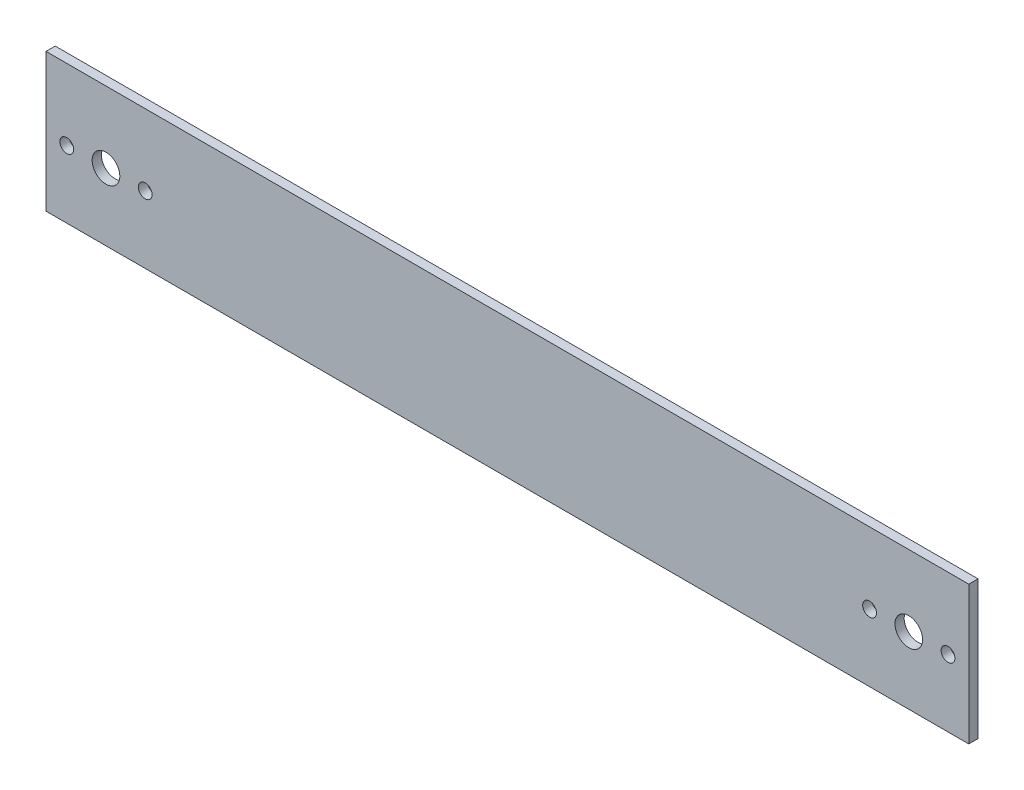
ISO-10303-21;
HEADER;
FILE_DESCRIPTION(('STEP AP214'),'2;1');
FILE_NAME('part.step','',(''),(''),'','','');
FILE_SCHEMA(('AUTOMOTIVE_DESIGN { 1 0 10303 214 1 1 1 1 }'));
ENDSEC;
DATA;
#1=APPLICATION_CONTEXT('core data for automotive mechanical design processes');
#2=APPLICATION_PROTOCOL_DEFINITION('international standard','automotive_design',2000,#1);
#3=PRODUCT_CONTEXT('',#1,'mechanical');
#4=PRODUCT('Part','Part','',(#3));
#5=PRODUCT_RELATED_PRODUCT_CATEGORY('part','',(#4));
#6=PRODUCT_DEFINITION_FORMATION('','',#4);
#7=PRODUCT_DEFINITION_CONTEXT('part definition',#1,'design');
#8=PRODUCT_DEFINITION('design','',#6,#7);
#9=PRODUCT_DEFINITION_SHAPE('','',#8);
#10=(LENGTH_UNIT() NAMED_UNIT(*) SI_UNIT(.MILLI.,.METRE.));
#11=(NAMED_UNIT(*) PLANE_ANGLE_UNIT() SI_UNIT($,.RADIAN.));
#12=(NAMED_UNIT(*) SI_UNIT($,.STERADIAN.) SOLID_ANGLE_UNIT());
#13=UNCERTAINTY_MEASURE_WITH_UNIT(LENGTH_MEASURE(1.E-05),#10,'distance_accuracy_value','');
#14=(GEOMETRIC_REPRESENTATION_CONTEXT(3) GLOBAL_UNCERTAINTY_ASSIGNED_CONTEXT((#13)) GLOBAL_UNIT_ASSIGNED_CONTEXT((#10,
#11,#12)) REPRESENTATION_CONTEXT('',''));
#15=CARTESIAN_POINT('',(0.,0.,0.));
#16=DIRECTION('',(0.,0.,1.));
#17=DIRECTION('',(1.,0.,0.));
#18=AXIS2_PLACEMENT_3D('',#15,#16,#17);
#19=CARTESIAN_POINT('',(-77.4628879892038,5.62753036437248,2.));
#20=DIRECTION('',(1.,0.,0.));
#21=DIRECTION('',(0.,0.,-1.));
#22=AXIS2_PLACEMENT_3D('',#19,#20,#21);
#23=PLANE('',#22);
#24=DIRECTION('',(0.,-1.,0.));
#25=VECTOR('',#24,1.);
#26=CARTESIAN_POINT('',(-77.4628879892038,5.62753036437248,0.));
#27=LINE('',#26,#25);
#28=CARTESIAN_POINT('',(-77.4628879892038,35.6275303643725,0.));
#29=VERTEX_POINT('',#28);
#30=CARTESIAN_POINT('',(-77.4628879892038,5.62753036437248,0.));
#31=VERTEX_POINT('',#30);
#32=EDGE_CURVE('E86',#29,#31,#27,.T.);
#33=ORIENTED_EDGE('',*,*,#32,.T.);
#34=DIRECTION('',(0.,0.,-1.));
#35=VECTOR('',#34,1.);
#36=CARTESIAN_POINT('',(-77.4628879892038,5.62753036437248,2.));
#37=LINE('',#36,#35);
#38=CARTESIAN_POINT('',(-77.4628879892038,5.62753036437248,2.));
#39=VERTEX_POINT('',#38);
#40=EDGE_CURVE('E11',#39,#31,#37,.T.);
#41=ORIENTED_EDGE('',*,*,#40,.F.);
#42=DIRECTION('',(0.,-1.,0.));
#43=VECTOR('',#42,1.);
#44=CARTESIAN_POINT('',(-77.4628879892038,5.62753036437248,2.));
#45=LINE('',#44,#43);
#46=CARTESIAN_POINT('',(-77.4628879892038,35.6275303643725,2.));
#47=VERTEX_POINT('',#46);
#48=EDGE_CURVE('E125',#47,#39,#45,.T.);
#49=ORIENTED_EDGE('',*,*,#48,.F.);
#50=DIRECTION('',(0.,0.,-1.));
#51=VECTOR('',#50,1.);
#52=CARTESIAN_POINT('',(-77.4628879892038,35.6275303643725,2.));
#53=LINE('',#52,#51);
#54=EDGE_CURVE('E46',#47,#29,#53,.T.);
#55=ORIENTED_EDGE('',*,*,#54,.T.);
#56=EDGE_LOOP('',(#33,#41,#49,#55));
#57=FACE_BOUND('',#56,.T.);
#58=ADVANCED_FACE('F38',(#57),#23,.F.);
#59=CARTESIAN_POINT('',(22.5371120107962,5.62753036437249,2.));
#60=DIRECTION('',(0.,1.,0.));
#61=DIRECTION('',(-1.,0.,0.));
#62=AXIS2_PLACEMENT_3D('',#59,#60,#61);
#63=PLANE('',#62);
#64=DIRECTION('',(1.,0.,0.));
#65=VECTOR('',#64,1.);
#66=CARTESIAN_POINT('',(22.5371120107962,5.62753036437249,0.));
#67=LINE('',#66,#65);
#68=CARTESIAN_POINT('',(122.537112010796,5.62753036437248,0.));
#69=VERTEX_POINT('',#68);
#70=EDGE_CURVE('E66',#31,#69,#67,.T.);
#71=ORIENTED_EDGE('',*,*,#70,.T.);
#72=DIRECTION('',(0.,0.,-1.));
#73=VECTOR('',#72,1.);
#74=CARTESIAN_POINT('',(122.537112010796,5.62753036437248,2.));
#75=LINE('',#74,#73);
#76=CARTESIAN_POINT('',(122.537112010796,5.62753036437248,2.));
#77=VERTEX_POINT('',#76);
#78=EDGE_CURVE('E81',#77,#69,#75,.T.);
#79=ORIENTED_EDGE('',*,*,#78,.F.);
#80=DIRECTION('',(1.,0.,0.));
#81=VECTOR('',#80,1.);
#82=CARTESIAN_POINT('',(22.5371120107962,5.62753036437249,2.));
#83=LINE('',#82,#81);
#84=EDGE_CURVE('E71',#39,#77,#83,.T.);
#85=ORIENTED_EDGE('',*,*,#84,.F.);
#86=ORIENTED_EDGE('',*,*,#40,.T.);
#87=EDGE_LOOP('',(#71,#79,#85,#86));
#88=FACE_BOUND('',#87,.T.);
#89=ADVANCED_FACE('F80',(#88),#63,.F.);
#90=CARTESIAN_POINT('',(-77.4628879892038,35.6275303643725,2.));
#91=DIRECTION('',(0.,-1.,0.));
#92=DIRECTION('',(0.,0.,-1.));
#93=AXIS2_PLACEMENT_3D('',#90,#91,#92);
#94=PLANE('',#93);
#95=DIRECTION('',(-1.,0.,0.));
#96=VECTOR('',#95,1.);
#97=CARTESIAN_POINT('',(-77.4628879892038,35.6275303643725,0.));
#98=LINE('',#97,#96);
#99=CARTESIAN_POINT('',(122.537112010796,35.6275303643725,0.));
#100=VERTEX_POINT('',#99);
#101=EDGE_CURVE('E85',#100,#29,#98,.T.);
#102=ORIENTED_EDGE('',*,*,#101,.T.);
#103=ORIENTED_EDGE('',*,*,#54,.F.);
#104=DIRECTION('',(-1.,0.,0.));
#105=VECTOR('',#104,1.);
#106=CARTESIAN_POINT('',(-77.4628879892038,35.6275303643725,2.));
#107=LINE('',#106,#105);
#108=CARTESIAN_POINT('',(122.537112010796,35.6275303643725,2.));
#109=VERTEX_POINT('',#108);
#110=EDGE_CURVE('E54',#109,#47,#107,.T.);
#111=ORIENTED_EDGE('',*,*,#110,.F.);
#112=DIRECTION('',(0.,0.,-1.));
#113=VECTOR('',#112,1.);
#114=CARTESIAN_POINT('',(122.537112010796,35.6275303643725,2.));
#115=LINE('',#114,#113);
#116=EDGE_CURVE('E94',#109,#100,#115,.T.);
#117=ORIENTED_EDGE('',*,*,#116,.T.);
#118=EDGE_LOOP('',(#102,#103,#111,#117));
#119=FACE_BOUND('',#118,.T.);
#120=ADVANCED_FACE('F134',(#119),#94,.F.);
#121=CARTESIAN_POINT('',(0.,0.,2.));
#122=DIRECTION('',(0.,0.,-1.));
#123=DIRECTION('',(-1.,0.,0.));
#124=AXIS2_PLACEMENT_3D('',#121,#122,#123);
#125=PLANE('',#124);
#126=CARTESIAN_POINT('',(101.037112010796,20.1969844792811,2.));
#127=DIRECTION('',(0.,0.,-1.));
#128=DIRECTION('',(-1.,0.,0.));
#129=AXIS2_PLACEMENT_3D('',#126,#127,#128);
#130=CIRCLE('',#129,1.50000000000003);
#131=CARTESIAN_POINT('',(99.5371120107962,20.1969844792811,2.));
#132=VERTEX_POINT('',#131);
#133=EDGE_CURVE('E278',#132,#132,#130,.T.);
#134=ORIENTED_EDGE('',*,*,#133,.T.);
#135=EDGE_LOOP('',(#134));
#136=FACE_BOUND('',#135,.T.);
#137=CARTESIAN_POINT('',(118.037112010796,20.1969844792811,2.));
#138=DIRECTION('',(0.,0.,-1.));
#139=DIRECTION('',(-1.,0.,0.));
#140=AXIS2_PLACEMENT_3D('',#137,#138,#139);
#141=CIRCLE('',#140,1.50000000000001);
#142=CARTESIAN_POINT('',(116.537112010796,20.1969844792811,2.));
#143=VERTEX_POINT('',#142);
#144=EDGE_CURVE('E280',#143,#143,#141,.T.);
#145=ORIENTED_EDGE('',*,*,#144,.T.);
#146=EDGE_LOOP('',(#145));
#147=FACE_BOUND('',#146,.T.);
#148=CARTESIAN_POINT('',(109.537112010796,20.1969844792811,2.));
#149=DIRECTION('',(0.,0.,-1.));
#150=DIRECTION('',(-1.,0.,0.));
#151=AXIS2_PLACEMENT_3D('',#148,#149,#150);
#152=CIRCLE('',#151,2.99999999999999);
#153=CARTESIAN_POINT('',(106.537112010796,20.1969844792811,2.));
#154=VERTEX_POINT('',#153);
#155=EDGE_CURVE('E102',#154,#154,#152,.T.);
#156=ORIENTED_EDGE('',*,*,#155,.T.);
#157=EDGE_LOOP('',(#156));
#158=FACE_BOUND('',#157,.T.);
#159=CARTESIAN_POINT('',(-55.9628879892038,20.1969844792811,2.));
#160=DIRECTION('',(0.,0.,1.));
#161=DIRECTION('',(1.,0.,0.));
#162=AXIS2_PLACEMENT_3D('',#159,#160,#161);
#163=CIRCLE('',#162,1.50000000000003);
#164=CARTESIAN_POINT('',(-54.4628879892037,20.1969844792811,2.));
#165=VERTEX_POINT('',#164);
#166=EDGE_CURVE('E107',#165,#165,#163,.T.);
#167=ORIENTED_EDGE('',*,*,#166,.F.);
#168=EDGE_LOOP('',(#167));
#169=FACE_BOUND('',#168,.T.);
#170=CARTESIAN_POINT('',(-72.9628879892038,20.1969844792811,2.));
#171=DIRECTION('',(0.,0.,1.));
#172=DIRECTION('',(1.,0.,0.));
#173=AXIS2_PLACEMENT_3D('',#170,#171,#172);
#174=CIRCLE('',#173,1.50000000000001);
#175=CARTESIAN_POINT('',(-71.4628879892037,20.1969844792811,2.));
#176=VERTEX_POINT('',#175);
#177=EDGE_CURVE('E112',#176,#176,#174,.T.);
#178=ORIENTED_EDGE('',*,*,#177,.F.);
#179=EDGE_LOOP('',(#178));
#180=FACE_BOUND('',#179,.T.);
#181=CARTESIAN_POINT('',(-64.4628879892038,20.1969844792811,2.));
#182=DIRECTION('',(0.,0.,1.));
#183=DIRECTION('',(1.,0.,0.));
#184=AXIS2_PLACEMENT_3D('',#181,#182,#183);
#185=CIRCLE('',#184,2.99999999999999);
#186=CARTESIAN_POINT('',(-61.4628879892038,20.1969844792811,2.));
#187=VERTEX_POINT('',#186);
#188=EDGE_CURVE('E111',#187,#187,#185,.T.);
#189=ORIENTED_EDGE('',*,*,#188,.F.);
#190=EDGE_LOOP('',(#189));
#191=FACE_BOUND('',#190,.T.);
#192=ORIENTED_EDGE('',*,*,#48,.T.);
#193=ORIENTED_EDGE('',*,*,#84,.T.);
#194=DIRECTION('',(0.,-1.,0.));
#195=VECTOR('',#194,1.);
#196=CARTESIAN_POINT('',(122.537112010796,5.62753036437248,2.));
#197=LINE('',#196,#195);
#198=EDGE_CURVE('E93',#109,#77,#197,.T.);
#199=ORIENTED_EDGE('',*,*,#198,.F.);
#200=ORIENTED_EDGE('',*,*,#110,.T.);
#201=EDGE_LOOP('',(#192,#193,#199,#200));
#202=FACE_BOUND('',#201,.T.);
#203=ADVANCED_FACE('F135',(#136,#147,#158,#169,#180,#191,#202),#125,.F.);
#204=CARTESIAN_POINT('',(0.,0.,0.));
#205=DIRECTION('',(0.,0.,-1.));
#206=DIRECTION('',(-1.,0.,0.));
#207=AXIS2_PLACEMENT_3D('',#204,#205,#206);
#208=PLANE('',#207);
#209=CARTESIAN_POINT('',(101.037112010796,20.1969844792811,0.));
#210=DIRECTION('',(0.,0.,-1.));
#211=DIRECTION('',(-1.,0.,0.));
#212=AXIS2_PLACEMENT_3D('',#209,#210,#211);
#213=CIRCLE('',#212,1.50000000000003);
#214=CARTESIAN_POINT('',(99.5371120107962,20.1969844792811,0.));
#215=VERTEX_POINT('',#214);
#216=EDGE_CURVE('E276',#215,#215,#213,.T.);
#217=ORIENTED_EDGE('',*,*,#216,.F.);
#218=EDGE_LOOP('',(#217));
#219=FACE_BOUND('',#218,.T.);
#220=CARTESIAN_POINT('',(118.037112010796,20.1969844792811,0.));
#221=DIRECTION('',(0.,0.,-1.));
#222=DIRECTION('',(-1.,0.,0.));
#223=AXIS2_PLACEMENT_3D('',#220,#221,#222);
#224=CIRCLE('',#223,1.50000000000001);
#225=CARTESIAN_POINT('',(116.537112010796,20.1969844792811,0.));
#226=VERTEX_POINT('',#225);
#227=EDGE_CURVE('E284',#226,#226,#224,.T.);
#228=ORIENTED_EDGE('',*,*,#227,.F.);
#229=EDGE_LOOP('',(#228));
#230=FACE_BOUND('',#229,.T.);
#231=CARTESIAN_POINT('',(109.537112010796,20.1969844792811,0.));
#232=DIRECTION('',(0.,0.,-1.));
#233=DIRECTION('',(-1.,0.,0.));
#234=AXIS2_PLACEMENT_3D('',#231,#232,#233);
#235=CIRCLE('',#234,2.99999999999999);
#236=CARTESIAN_POINT('',(106.537112010796,20.1969844792811,0.));
#237=VERTEX_POINT('',#236);
#238=EDGE_CURVE('E98',#237,#237,#235,.T.);
#239=ORIENTED_EDGE('',*,*,#238,.F.);
#240=EDGE_LOOP('',(#239));
#241=FACE_BOUND('',#240,.T.);
#242=CARTESIAN_POINT('',(-55.9628879892038,20.1969844792811,0.));
#243=DIRECTION('',(0.,0.,1.));
#244=DIRECTION('',(1.,0.,0.));
#245=AXIS2_PLACEMENT_3D('',#242,#243,#244);
#246=CIRCLE('',#245,1.50000000000003);
#247=CARTESIAN_POINT('',(-54.4628879892037,20.1969844792811,0.));
#248=VERTEX_POINT('',#247);
#249=EDGE_CURVE('E115',#248,#248,#246,.T.);
#250=ORIENTED_EDGE('',*,*,#249,.T.);
#251=EDGE_LOOP('',(#250));
#252=FACE_BOUND('',#251,.T.);
#253=CARTESIAN_POINT('',(-72.9628879892038,20.1969844792811,0.));
#254=DIRECTION('',(0.,0.,1.));
#255=DIRECTION('',(1.,0.,0.));
#256=AXIS2_PLACEMENT_3D('',#253,#254,#255);
#257=CIRCLE('',#256,1.50000000000001);
#258=CARTESIAN_POINT('',(-71.4628879892037,20.1969844792811,0.));
#259=VERTEX_POINT('',#258);
#260=EDGE_CURVE('E108',#259,#259,#257,.T.);
#261=ORIENTED_EDGE('',*,*,#260,.T.);
#262=EDGE_LOOP('',(#261));
#263=FACE_BOUND('',#262,.T.);
#264=CARTESIAN_POINT('',(-64.4628879892038,20.1969844792811,0.));
#265=DIRECTION('',(0.,0.,1.));
#266=DIRECTION('',(1.,0.,0.));
#267=AXIS2_PLACEMENT_3D('',#264,#265,#266);
#268=CIRCLE('',#267,2.99999999999999);
#269=CARTESIAN_POINT('',(-61.4628879892038,20.1969844792811,0.));
#270=VERTEX_POINT('',#269);
#271=EDGE_CURVE('E120',#270,#270,#268,.T.);
#272=ORIENTED_EDGE('',*,*,#271,.T.);
#273=EDGE_LOOP('',(#272));
#274=FACE_BOUND('',#273,.T.);
#275=ORIENTED_EDGE('',*,*,#32,.F.);
#276=ORIENTED_EDGE('',*,*,#101,.F.);
#277=DIRECTION('',(0.,-1.,0.));
#278=VECTOR('',#277,1.);
#279=CARTESIAN_POINT('',(122.537112010796,5.62753036437248,0.));
#280=LINE('',#279,#278);
#281=EDGE_CURVE('E92',#100,#69,#280,.T.);
#282=ORIENTED_EDGE('',*,*,#281,.T.);
#283=ORIENTED_EDGE('',*,*,#70,.F.);
#284=EDGE_LOOP('',(#275,#276,#282,#283));
#285=FACE_BOUND('',#284,.T.);
#286=ADVANCED_FACE('F96',(#219,#230,#241,#252,#263,#274,#285),#208,.T.);
#287=CARTESIAN_POINT('',(-64.4628879892038,20.1969844792811,0.));
#288=DIRECTION('',(0.,0.,1.));
#289=DIRECTION('',(1.,0.,0.));
#290=AXIS2_PLACEMENT_3D('',#287,#288,#289);
#291=CYLINDRICAL_SURFACE('',#290,2.99999999999999);
#292=ORIENTED_EDGE('',*,*,#271,.F.);
#293=EDGE_LOOP('',(#292));
#294=FACE_BOUND('',#293,.T.);
#295=ORIENTED_EDGE('',*,*,#188,.T.);
#296=EDGE_LOOP('',(#295));
#297=FACE_BOUND('',#296,.T.);
#298=ADVANCED_FACE('F143',(#294,#297),#291,.F.);
#299=CARTESIAN_POINT('',(-72.9628879892038,20.1969844792811,0.));
#300=DIRECTION('',(0.,0.,1.));
#301=DIRECTION('',(1.,0.,0.));
#302=AXIS2_PLACEMENT_3D('',#299,#300,#301);
#303=CYLINDRICAL_SURFACE('',#302,1.50000000000001);
#304=ORIENTED_EDGE('',*,*,#260,.F.);
#305=EDGE_LOOP('',(#304));
#306=FACE_BOUND('',#305,.T.);
#307=ORIENTED_EDGE('',*,*,#177,.T.);
#308=EDGE_LOOP('',(#307));
#309=FACE_BOUND('',#308,.T.);
#310=ADVANCED_FACE('F222',(#306,#309),#303,.F.);
#311=CARTESIAN_POINT('',(-55.9628879892038,20.1969844792811,0.));
#312=DIRECTION('',(0.,0.,1.));
#313=DIRECTION('',(1.,0.,0.));
#314=AXIS2_PLACEMENT_3D('',#311,#312,#313);
#315=CYLINDRICAL_SURFACE('',#314,1.50000000000003);
#316=ORIENTED_EDGE('',*,*,#249,.F.);
#317=EDGE_LOOP('',(#316));
#318=FACE_BOUND('',#317,.T.);
#319=ORIENTED_EDGE('',*,*,#166,.T.);
#320=EDGE_LOOP('',(#319));
#321=FACE_BOUND('',#320,.T.);
#322=ADVANCED_FACE('F185',(#318,#321),#315,.F.);
#323=CARTESIAN_POINT('',(122.537112010796,5.62753036437248,2.));
#324=DIRECTION('',(1.,0.,0.));
#325=DIRECTION('',(0.,0.,-1.));
#326=AXIS2_PLACEMENT_3D('',#323,#324,#325);
#327=PLANE('',#326);
#328=ORIENTED_EDGE('',*,*,#281,.F.);
#329=ORIENTED_EDGE('',*,*,#116,.F.);
#330=ORIENTED_EDGE('',*,*,#198,.T.);
#331=ORIENTED_EDGE('',*,*,#78,.T.);
#332=EDGE_LOOP('',(#328,#329,#330,#331));
#333=FACE_BOUND('',#332,.T.);
#334=ADVANCED_FACE('F90',(#333),#327,.T.);
#335=CARTESIAN_POINT('',(109.537112010796,20.1969844792811,0.));
#336=DIRECTION('',(0.,0.,1.));
#337=DIRECTION('',(1.,0.,0.));
#338=AXIS2_PLACEMENT_3D('',#335,#336,#337);
#339=CYLINDRICAL_SURFACE('',#338,2.99999999999999);
#340=ORIENTED_EDGE('',*,*,#238,.T.);
#341=EDGE_LOOP('',(#340));
#342=FACE_BOUND('',#341,.T.);
#343=ORIENTED_EDGE('',*,*,#155,.F.);
#344=EDGE_LOOP('',(#343));
#345=FACE_BOUND('',#344,.T.);
#346=ADVANCED_FACE('F184',(#342,#345),#339,.F.);
#347=CARTESIAN_POINT('',(118.037112010796,20.1969844792811,0.));
#348=DIRECTION('',(0.,0.,1.));
#349=DIRECTION('',(1.,0.,0.));
#350=AXIS2_PLACEMENT_3D('',#347,#348,#349);
#351=CYLINDRICAL_SURFACE('',#350,1.50000000000001);
#352=ORIENTED_EDGE('',*,*,#227,.T.);
#353=EDGE_LOOP('',(#352));
#354=FACE_BOUND('',#353,.T.);
#355=ORIENTED_EDGE('',*,*,#144,.F.);
#356=EDGE_LOOP('',(#355));
#357=FACE_BOUND('',#356,.T.);
#358=ADVANCED_FACE('F195',(#354,#357),#351,.F.);
#359=CARTESIAN_POINT('',(101.037112010796,20.1969844792811,0.));
#360=DIRECTION('',(0.,0.,1.));
#361=DIRECTION('',(1.,0.,0.));
#362=AXIS2_PLACEMENT_3D('',#359,#360,#361);
#363=CYLINDRICAL_SURFACE('',#362,1.50000000000003);
#364=ORIENTED_EDGE('',*,*,#216,.T.);
#365=EDGE_LOOP('',(#364));
#366=FACE_BOUND('',#365,.T.);
#367=ORIENTED_EDGE('',*,*,#133,.F.);
#368=EDGE_LOOP('',(#367));
#369=FACE_BOUND('',#368,.T.);
#370=ADVANCED_FACE('F205',(#366,#369),#363,.F.);
#371=CLOSED_SHELL('',(#58,#89,#120,#203,#286,#298,#310,#322,#334,#346,#358,#370));
#372=MANIFOLD_SOLID_BREP('B2',#371);
#373=ADVANCED_BREP_SHAPE_REPRESENTATION('',(#18,#372),#14);
#374=SHAPE_DEFINITION_REPRESENTATION(#9,#373);
ENDSEC;
END-ISO-10303-21;
